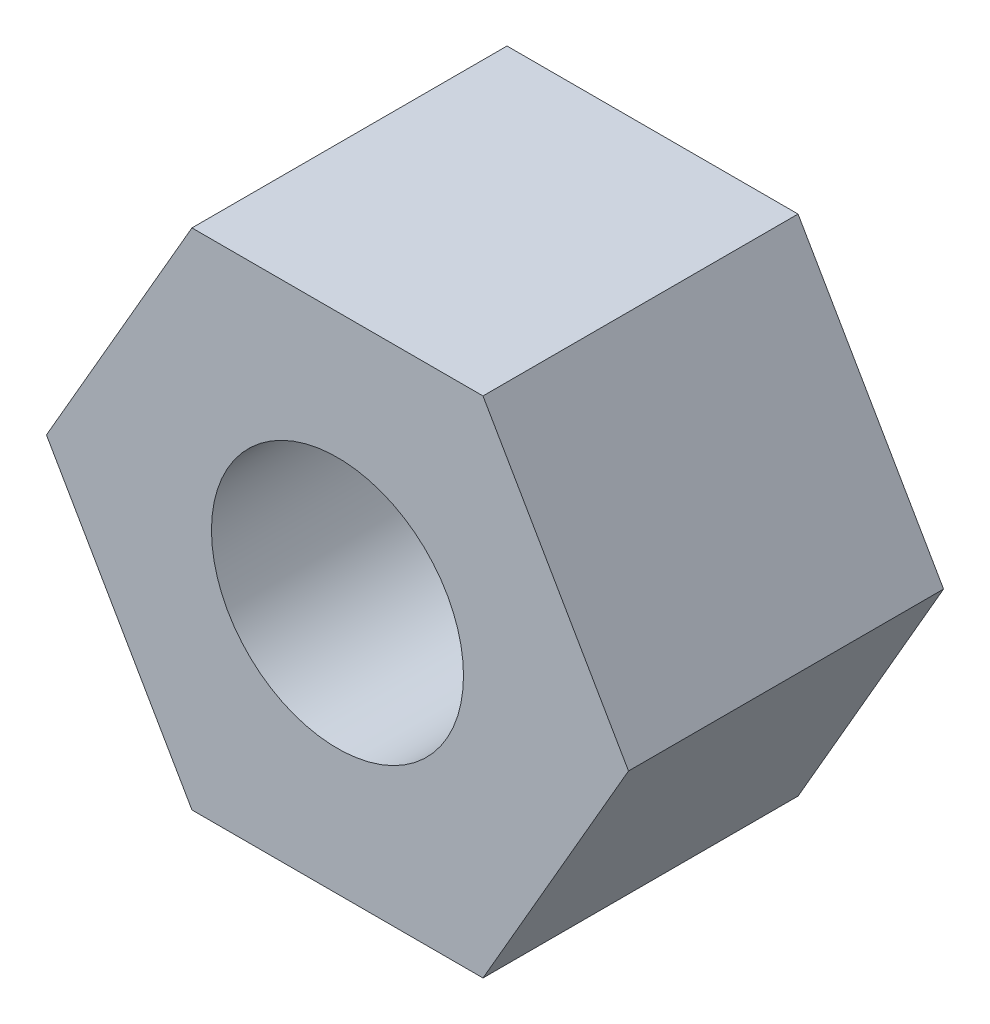
ISO-10303-21;
HEADER;
FILE_DESCRIPTION(('STEP AP214'),'2;1');
FILE_NAME('part.step','',(''),(''),'','','');
FILE_SCHEMA(('AUTOMOTIVE_DESIGN { 1 0 10303 214 1 1 1 1 }'));
ENDSEC;
DATA;
#1=APPLICATION_CONTEXT('core data for automotive mechanical design processes');
#2=APPLICATION_PROTOCOL_DEFINITION('international standard','automotive_design',2000,#1);
#3=PRODUCT_CONTEXT('',#1,'mechanical');
#4=PRODUCT('Part','Part','',(#3));
#5=PRODUCT_RELATED_PRODUCT_CATEGORY('part','',(#4));
#6=PRODUCT_DEFINITION_FORMATION('','',#4);
#7=PRODUCT_DEFINITION_CONTEXT('part definition',#1,'design');
#8=PRODUCT_DEFINITION('design','',#6,#7);
#9=PRODUCT_DEFINITION_SHAPE('','',#8);
#10=(LENGTH_UNIT() NAMED_UNIT(*) SI_UNIT(.MILLI.,.METRE.));
#11=(NAMED_UNIT(*) PLANE_ANGLE_UNIT() SI_UNIT($,.RADIAN.));
#12=(NAMED_UNIT(*) SI_UNIT($,.STERADIAN.) SOLID_ANGLE_UNIT());
#13=UNCERTAINTY_MEASURE_WITH_UNIT(LENGTH_MEASURE(1.E-05),#10,'distance_accuracy_value','');
#14=(GEOMETRIC_REPRESENTATION_CONTEXT(3) GLOBAL_UNCERTAINTY_ASSIGNED_CONTEXT((#13)) GLOBAL_UNIT_ASSIGNED_CONTEXT((#10,
#11,#12)) REPRESENTATION_CONTEXT('',''));
#15=CARTESIAN_POINT('',(0.,0.,0.));
#16=DIRECTION('',(0.,0.,1.));
#17=DIRECTION('',(1.,0.,0.));
#18=AXIS2_PLACEMENT_3D('',#15,#16,#17);
#19=CARTESIAN_POINT('',(2.3094010767585,-4.,5.));
#20=DIRECTION('',(-0.866025403784439,0.5,0.));
#21=DIRECTION('',(-0.5,-0.866025403784439,0.));
#22=AXIS2_PLACEMENT_3D('',#19,#20,#21);
#23=PLANE('',#22);
#24=DIRECTION('',(0.5,0.866025403784439,0.));
#25=VECTOR('',#24,1.);
#26=CARTESIAN_POINT('',(2.3094010767585,-4.,0.));
#27=LINE('',#26,#25);
#28=CARTESIAN_POINT('',(2.3094010767585,-4.,0.));
#29=VERTEX_POINT('',#28);
#30=CARTESIAN_POINT('',(4.61880215351701,0.,0.));
#31=VERTEX_POINT('',#30);
#32=EDGE_CURVE('E119',#29,#31,#27,.T.);
#33=ORIENTED_EDGE('',*,*,#32,.T.);
#34=DIRECTION('',(0.,0.,-1.));
#35=VECTOR('',#34,1.);
#36=CARTESIAN_POINT('',(4.61880215351701,0.,5.));
#37=LINE('',#36,#35);
#38=CARTESIAN_POINT('',(4.61880215351701,0.,5.));
#39=VERTEX_POINT('',#38);
#40=EDGE_CURVE('E11',#39,#31,#37,.T.);
#41=ORIENTED_EDGE('',*,*,#40,.F.);
#42=DIRECTION('',(0.5,0.866025403784439,0.));
#43=VECTOR('',#42,1.);
#44=CARTESIAN_POINT('',(2.3094010767585,-4.,5.));
#45=LINE('',#44,#43);
#46=CARTESIAN_POINT('',(2.3094010767585,-4.,5.));
#47=VERTEX_POINT('',#46);
#48=EDGE_CURVE('E130',#47,#39,#45,.T.);
#49=ORIENTED_EDGE('',*,*,#48,.F.);
#50=DIRECTION('',(0.,0.,-1.));
#51=VECTOR('',#50,1.);
#52=CARTESIAN_POINT('',(2.3094010767585,-4.,5.));
#53=LINE('',#52,#51);
#54=EDGE_CURVE('E115',#47,#29,#53,.T.);
#55=ORIENTED_EDGE('',*,*,#54,.T.);
#56=EDGE_LOOP('',(#33,#41,#49,#55));
#57=FACE_BOUND('',#56,.T.);
#58=ADVANCED_FACE('F35',(#57),#23,.F.);
#59=CARTESIAN_POINT('',(4.61880215351701,0.,5.));
#60=DIRECTION('',(-0.866025403784439,-0.5,0.));
#61=DIRECTION('',(0.5,-0.866025403784439,0.));
#62=AXIS2_PLACEMENT_3D('',#59,#60,#61);
#63=PLANE('',#62);
#64=DIRECTION('',(-0.5,0.866025403784439,0.));
#65=VECTOR('',#64,1.);
#66=CARTESIAN_POINT('',(4.61880215351701,0.,0.));
#67=LINE('',#66,#65);
#68=CARTESIAN_POINT('',(2.3094010767585,4.,0.));
#69=VERTEX_POINT('',#68);
#70=EDGE_CURVE('E122',#31,#69,#67,.T.);
#71=ORIENTED_EDGE('',*,*,#70,.T.);
#72=DIRECTION('',(0.,0.,-1.));
#73=VECTOR('',#72,1.);
#74=CARTESIAN_POINT('',(2.3094010767585,4.,5.));
#75=LINE('',#74,#73);
#76=CARTESIAN_POINT('',(2.3094010767585,4.,5.));
#77=VERTEX_POINT('',#76);
#78=EDGE_CURVE('E43',#77,#69,#75,.T.);
#79=ORIENTED_EDGE('',*,*,#78,.F.);
#80=DIRECTION('',(-0.5,0.866025403784439,0.));
#81=VECTOR('',#80,1.);
#82=CARTESIAN_POINT('',(4.61880215351701,0.,5.));
#83=LINE('',#82,#81);
#84=EDGE_CURVE('E88',#39,#77,#83,.T.);
#85=ORIENTED_EDGE('',*,*,#84,.F.);
#86=ORIENTED_EDGE('',*,*,#40,.T.);
#87=EDGE_LOOP('',(#71,#79,#85,#86));
#88=FACE_BOUND('',#87,.T.);
#89=ADVANCED_FACE('F155',(#88),#63,.F.);
#90=CARTESIAN_POINT('',(2.3094010767585,4.,5.));
#91=DIRECTION('',(0.,-1.,0.));
#92=DIRECTION('',(0.,0.,-1.));
#93=AXIS2_PLACEMENT_3D('',#90,#91,#92);
#94=PLANE('',#93);
#95=DIRECTION('',(-1.,0.,0.));
#96=VECTOR('',#95,1.);
#97=CARTESIAN_POINT('',(2.3094010767585,4.,0.));
#98=LINE('',#97,#96);
#99=CARTESIAN_POINT('',(-2.3094010767585,4.,0.));
#100=VERTEX_POINT('',#99);
#101=EDGE_CURVE('E125',#69,#100,#98,.T.);
#102=ORIENTED_EDGE('',*,*,#101,.T.);
#103=DIRECTION('',(0.,0.,-1.));
#104=VECTOR('',#103,1.);
#105=CARTESIAN_POINT('',(-2.3094010767585,4.,5.));
#106=LINE('',#105,#104);
#107=CARTESIAN_POINT('',(-2.3094010767585,4.,5.));
#108=VERTEX_POINT('',#107);
#109=EDGE_CURVE('E110',#108,#100,#106,.T.);
#110=ORIENTED_EDGE('',*,*,#109,.F.);
#111=DIRECTION('',(-1.,0.,0.));
#112=VECTOR('',#111,1.);
#113=CARTESIAN_POINT('',(2.3094010767585,4.,5.));
#114=LINE('',#113,#112);
#115=EDGE_CURVE('E101',#77,#108,#114,.T.);
#116=ORIENTED_EDGE('',*,*,#115,.F.);
#117=ORIENTED_EDGE('',*,*,#78,.T.);
#118=EDGE_LOOP('',(#102,#110,#116,#117));
#119=FACE_BOUND('',#118,.T.);
#120=ADVANCED_FACE('F136',(#119),#94,.F.);
#121=CARTESIAN_POINT('',(-2.3094010767585,4.,5.));
#122=DIRECTION('',(0.866025403784439,-0.5,0.));
#123=DIRECTION('',(0.5,0.866025403784439,0.));
#124=AXIS2_PLACEMENT_3D('',#121,#122,#123);
#125=PLANE('',#124);
#126=DIRECTION('',(-0.5,-0.866025403784439,0.));
#127=VECTOR('',#126,1.);
#128=CARTESIAN_POINT('',(-2.3094010767585,4.,0.));
#129=LINE('',#128,#127);
#130=CARTESIAN_POINT('',(-4.61880215351701,0.,0.));
#131=VERTEX_POINT('',#130);
#132=EDGE_CURVE('E109',#100,#131,#129,.T.);
#133=ORIENTED_EDGE('',*,*,#132,.T.);
#134=DIRECTION('',(0.,0.,-1.));
#135=VECTOR('',#134,1.);
#136=CARTESIAN_POINT('',(-4.61880215351701,0.,5.));
#137=LINE('',#136,#135);
#138=CARTESIAN_POINT('',(-4.61880215351701,0.,5.));
#139=VERTEX_POINT('',#138);
#140=EDGE_CURVE('E106',#139,#131,#137,.T.);
#141=ORIENTED_EDGE('',*,*,#140,.F.);
#142=DIRECTION('',(-0.5,-0.866025403784439,0.));
#143=VECTOR('',#142,1.);
#144=CARTESIAN_POINT('',(-2.3094010767585,4.,5.));
#145=LINE('',#144,#143);
#146=EDGE_CURVE('E95',#108,#139,#145,.T.);
#147=ORIENTED_EDGE('',*,*,#146,.F.);
#148=ORIENTED_EDGE('',*,*,#109,.T.);
#149=EDGE_LOOP('',(#133,#141,#147,#148));
#150=FACE_BOUND('',#149,.T.);
#151=ADVANCED_FACE('F107',(#150),#125,.F.);
#152=CARTESIAN_POINT('',(-4.61880215351701,0.,5.));
#153=DIRECTION('',(0.866025403784439,0.5,0.));
#154=DIRECTION('',(-0.5,0.866025403784439,0.));
#155=AXIS2_PLACEMENT_3D('',#152,#153,#154);
#156=PLANE('',#155);
#157=DIRECTION('',(0.5,-0.866025403784439,0.));
#158=VECTOR('',#157,1.);
#159=CARTESIAN_POINT('',(-4.61880215351701,0.,0.));
#160=LINE('',#159,#158);
#161=CARTESIAN_POINT('',(-2.3094010767585,-4.,0.));
#162=VERTEX_POINT('',#161);
#163=EDGE_CURVE('E74',#131,#162,#160,.T.);
#164=ORIENTED_EDGE('',*,*,#163,.T.);
#165=DIRECTION('',(0.,0.,-1.));
#166=VECTOR('',#165,1.);
#167=CARTESIAN_POINT('',(-2.3094010767585,-4.,5.));
#168=LINE('',#167,#166);
#169=CARTESIAN_POINT('',(-2.3094010767585,-4.,5.));
#170=VERTEX_POINT('',#169);
#171=EDGE_CURVE('E111',#170,#162,#168,.T.);
#172=ORIENTED_EDGE('',*,*,#171,.F.);
#173=DIRECTION('',(0.5,-0.866025403784439,0.));
#174=VECTOR('',#173,1.);
#175=CARTESIAN_POINT('',(-4.61880215351701,0.,5.));
#176=LINE('',#175,#174);
#177=EDGE_CURVE('E99',#139,#170,#176,.T.);
#178=ORIENTED_EDGE('',*,*,#177,.F.);
#179=ORIENTED_EDGE('',*,*,#140,.T.);
#180=EDGE_LOOP('',(#164,#172,#178,#179));
#181=FACE_BOUND('',#180,.T.);
#182=ADVANCED_FACE('F113',(#181),#156,.F.);
#183=CARTESIAN_POINT('',(-2.3094010767585,-4.,5.));
#184=DIRECTION('',(0.,1.,0.));
#185=DIRECTION('',(-1.,0.,0.));
#186=AXIS2_PLACEMENT_3D('',#183,#184,#185);
#187=PLANE('',#186);
#188=DIRECTION('',(1.,0.,0.));
#189=VECTOR('',#188,1.);
#190=CARTESIAN_POINT('',(-2.3094010767585,-4.,0.));
#191=LINE('',#190,#189);
#192=EDGE_CURVE('E80',#162,#29,#191,.T.);
#193=ORIENTED_EDGE('',*,*,#192,.T.);
#194=ORIENTED_EDGE('',*,*,#54,.F.);
#195=DIRECTION('',(1.,0.,0.));
#196=VECTOR('',#195,1.);
#197=CARTESIAN_POINT('',(-2.3094010767585,-4.,5.));
#198=LINE('',#197,#196);
#199=EDGE_CURVE('E51',#170,#47,#198,.T.);
#200=ORIENTED_EDGE('',*,*,#199,.F.);
#201=ORIENTED_EDGE('',*,*,#171,.T.);
#202=EDGE_LOOP('',(#193,#194,#200,#201));
#203=FACE_BOUND('',#202,.T.);
#204=ADVANCED_FACE('F143',(#203),#187,.F.);
#205=CARTESIAN_POINT('',(0.,0.,5.));
#206=DIRECTION('',(0.,0.,1.));
#207=DIRECTION('',(1.,0.,0.));
#208=AXIS2_PLACEMENT_3D('',#205,#206,#207);
#209=PLANE('',#208);
#210=CARTESIAN_POINT('',(0.,0.,5.));
#211=DIRECTION('',(0.,0.,1.));
#212=DIRECTION('',(1.,0.,0.));
#213=AXIS2_PLACEMENT_3D('',#210,#211,#212);
#214=CIRCLE('',#213,2.);
#215=CARTESIAN_POINT('',(2.,0.,5.));
#216=VERTEX_POINT('',#215);
#217=EDGE_CURVE('E210',#216,#216,#214,.T.);
#218=ORIENTED_EDGE('',*,*,#217,.F.);
#219=EDGE_LOOP('',(#218));
#220=FACE_BOUND('',#219,.T.);
#221=ORIENTED_EDGE('',*,*,#48,.T.);
#222=ORIENTED_EDGE('',*,*,#84,.T.);
#223=ORIENTED_EDGE('',*,*,#115,.T.);
#224=ORIENTED_EDGE('',*,*,#146,.T.);
#225=ORIENTED_EDGE('',*,*,#177,.T.);
#226=ORIENTED_EDGE('',*,*,#199,.T.);
#227=EDGE_LOOP('',(#221,#222,#223,#224,#225,#226));
#228=FACE_BOUND('',#227,.T.);
#229=ADVANCED_FACE('F97',(#220,#228),#209,.T.);
#230=CARTESIAN_POINT('',(0.,0.,0.));
#231=DIRECTION('',(0.,0.,1.));
#232=DIRECTION('',(1.,0.,0.));
#233=AXIS2_PLACEMENT_3D('',#230,#231,#232);
#234=PLANE('',#233);
#235=CARTESIAN_POINT('',(0.,0.,0.));
#236=DIRECTION('',(0.,0.,1.));
#237=DIRECTION('',(1.,0.,0.));
#238=AXIS2_PLACEMENT_3D('',#235,#236,#237);
#239=CIRCLE('',#238,2.);
#240=CARTESIAN_POINT('',(2.,0.,0.));
#241=VERTEX_POINT('',#240);
#242=EDGE_CURVE('E123',#241,#241,#239,.T.);
#243=ORIENTED_EDGE('',*,*,#242,.T.);
#244=EDGE_LOOP('',(#243));
#245=FACE_BOUND('',#244,.T.);
#246=ORIENTED_EDGE('',*,*,#32,.F.);
#247=ORIENTED_EDGE('',*,*,#192,.F.);
#248=ORIENTED_EDGE('',*,*,#163,.F.);
#249=ORIENTED_EDGE('',*,*,#132,.F.);
#250=ORIENTED_EDGE('',*,*,#101,.F.);
#251=ORIENTED_EDGE('',*,*,#70,.F.);
#252=EDGE_LOOP('',(#246,#247,#248,#249,#250,#251));
#253=FACE_BOUND('',#252,.T.);
#254=ADVANCED_FACE('F139',(#245,#253),#234,.F.);
#255=CARTESIAN_POINT('',(0.,0.,0.));
#256=DIRECTION('',(0.,0.,1.));
#257=DIRECTION('',(1.,0.,0.));
#258=AXIS2_PLACEMENT_3D('',#255,#256,#257);
#259=CYLINDRICAL_SURFACE('',#258,2.);
#260=ORIENTED_EDGE('',*,*,#242,.F.);
#261=EDGE_LOOP('',(#260));
#262=FACE_BOUND('',#261,.T.);
#263=ORIENTED_EDGE('',*,*,#217,.T.);
#264=EDGE_LOOP('',(#263));
#265=FACE_BOUND('',#264,.T.);
#266=ADVANCED_FACE('F192',(#262,#265),#259,.F.);
#267=CLOSED_SHELL('',(#58,#89,#120,#151,#182,#204,#229,#254,#266));
#268=MANIFOLD_SOLID_BREP('B2',#267);
#269=ADVANCED_BREP_SHAPE_REPRESENTATION('',(#18,#268),#14);
#270=SHAPE_DEFINITION_REPRESENTATION(#9,#269);
ENDSEC;
END-ISO-10303-21;
